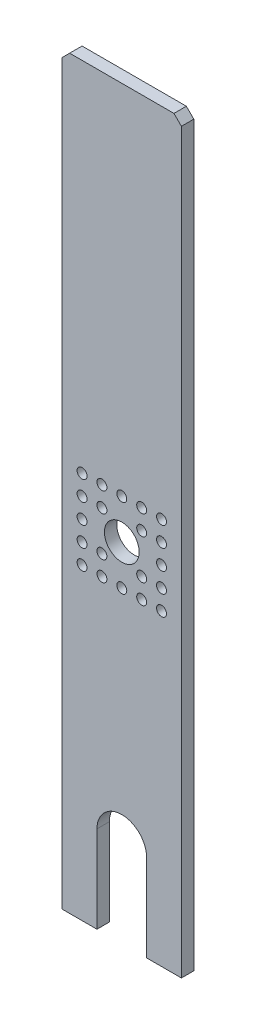
ISO-10303-21;
HEADER;
FILE_DESCRIPTION(('STEP AP214'),'2;1');
FILE_NAME('part.step','',(''),(''),'','','');
FILE_SCHEMA(('AUTOMOTIVE_DESIGN { 1 0 10303 214 1 1 1 1 }'));
ENDSEC;
DATA;
#1=APPLICATION_CONTEXT('core data for automotive mechanical design processes');
#2=APPLICATION_PROTOCOL_DEFINITION('international standard','automotive_design',2000,#1);
#3=PRODUCT_CONTEXT('',#1,'mechanical');
#4=PRODUCT('Part','Part','',(#3));
#5=PRODUCT_RELATED_PRODUCT_CATEGORY('part','',(#4));
#6=PRODUCT_DEFINITION_FORMATION('','',#4);
#7=PRODUCT_DEFINITION_CONTEXT('part definition',#1,'design');
#8=PRODUCT_DEFINITION('design','',#6,#7);
#9=PRODUCT_DEFINITION_SHAPE('','',#8);
#10=(LENGTH_UNIT() NAMED_UNIT(*) SI_UNIT(.MILLI.,.METRE.));
#11=(NAMED_UNIT(*) PLANE_ANGLE_UNIT() SI_UNIT($,.RADIAN.));
#12=(NAMED_UNIT(*) SI_UNIT($,.STERADIAN.) SOLID_ANGLE_UNIT());
#13=UNCERTAINTY_MEASURE_WITH_UNIT(LENGTH_MEASURE(1.E-05),#10,'distance_accuracy_value','');
#14=(GEOMETRIC_REPRESENTATION_CONTEXT(3) GLOBAL_UNCERTAINTY_ASSIGNED_CONTEXT((#13)) GLOBAL_UNIT_ASSIGNED_CONTEXT((#10,
#11,#12)) REPRESENTATION_CONTEXT('',''));
#15=CARTESIAN_POINT('',(0.,0.,0.));
#16=DIRECTION('',(0.,0.,1.));
#17=DIRECTION('',(1.,0.,0.));
#18=AXIS2_PLACEMENT_3D('',#15,#16,#17);
#19=CARTESIAN_POINT('',(0.,-300.,5.));
#20=DIRECTION('',(0.,1.,0.));
#21=DIRECTION('',(0.,0.,1.));
#22=AXIS2_PLACEMENT_3D('',#19,#20,#21);
#23=PLANE('',#22);
#24=DIRECTION('',(1.,0.,0.));
#25=VECTOR('',#24,1.);
#26=CARTESIAN_POINT('',(0.,-300.,5.));
#27=LINE('',#26,#25);
#28=CARTESIAN_POINT('',(34.,-300.,5.));
#29=VERTEX_POINT('',#28);
#30=CARTESIAN_POINT('',(48.,-300.,5.));
#31=VERTEX_POINT('',#30);
#32=EDGE_CURVE('E340',#29,#31,#27,.T.);
#33=ORIENTED_EDGE('',*,*,#32,.F.);
#34=DIRECTION('',(0.,0.,1.));
#35=VECTOR('',#34,1.);
#36=CARTESIAN_POINT('',(34.,-300.,0.));
#37=LINE('',#36,#35);
#38=CARTESIAN_POINT('',(34.,-300.,0.));
#39=VERTEX_POINT('',#38);
#40=EDGE_CURVE('E159',#39,#29,#37,.T.);
#41=ORIENTED_EDGE('',*,*,#40,.F.);
#42=DIRECTION('',(1.,0.,0.));
#43=VECTOR('',#42,1.);
#44=CARTESIAN_POINT('',(0.,-300.,0.));
#45=LINE('',#44,#43);
#46=CARTESIAN_POINT('',(48.,-300.,0.));
#47=VERTEX_POINT('',#46);
#48=EDGE_CURVE('E355',#39,#47,#45,.T.);
#49=ORIENTED_EDGE('',*,*,#48,.T.);
#50=DIRECTION('',(0.,0.,-1.));
#51=VECTOR('',#50,1.);
#52=CARTESIAN_POINT('',(48.,-300.,5.));
#53=LINE('',#52,#51);
#54=EDGE_CURVE('E348',#31,#47,#53,.T.);
#55=ORIENTED_EDGE('',*,*,#54,.F.);
#56=EDGE_LOOP('',(#33,#41,#49,#55));
#57=FACE_BOUND('',#56,.T.);
#58=ADVANCED_FACE('F40',(#57),#23,.F.);
#59=CARTESIAN_POINT('',(0.,0.,5.));
#60=DIRECTION('',(0.,0.,1.));
#61=DIRECTION('',(1.,0.,0.));
#62=AXIS2_PLACEMENT_3D('',#59,#60,#61);
#63=PLANE('',#62);
#64=DIRECTION('',(0.,1.,0.));
#65=VECTOR('',#64,1.);
#66=CARTESIAN_POINT('',(34.,-300.,5.));
#67=LINE('',#66,#65);
#68=CARTESIAN_POINT('',(34.,-265.,5.));
#69=VERTEX_POINT('',#68);
#70=EDGE_CURVE('E143',#29,#69,#67,.T.);
#71=ORIENTED_EDGE('',*,*,#70,.F.);
#72=ORIENTED_EDGE('',*,*,#32,.T.);
#73=DIRECTION('',(0.,1.,0.));
#74=VECTOR('',#73,1.);
#75=CARTESIAN_POINT('',(48.,-300.,5.));
#76=LINE('',#75,#74);
#77=CARTESIAN_POINT('',(48.,-3.00000000000006,5.));
#78=VERTEX_POINT('',#77);
#79=EDGE_CURVE('E345',#31,#78,#76,.T.);
#80=ORIENTED_EDGE('',*,*,#79,.T.);
#81=DIRECTION('',(0.707106781186544,-0.707106781186551,0.));
#82=VECTOR('',#81,1.);
#83=CARTESIAN_POINT('',(22.5000000000002,22.5,5.));
#84=LINE('',#83,#82);
#85=CARTESIAN_POINT('',(45.,0.,5.));
#86=VERTEX_POINT('',#85);
#87=EDGE_CURVE('E385',#78,#86,#84,.F.);
#88=ORIENTED_EDGE('',*,*,#87,.T.);
#89=DIRECTION('',(-1.,0.,0.));
#90=VECTOR('',#89,1.);
#91=CARTESIAN_POINT('',(48.,0.,5.));
#92=LINE('',#91,#90);
#93=CARTESIAN_POINT('',(3.,0.,5.));
#94=VERTEX_POINT('',#93);
#95=EDGE_CURVE('E332',#86,#94,#92,.T.);
#96=ORIENTED_EDGE('',*,*,#95,.T.);
#97=DIRECTION('',(0.707106781186547,0.707106781186548,0.));
#98=VECTOR('',#97,1.);
#99=CARTESIAN_POINT('',(1.5,-1.5,5.));
#100=LINE('',#99,#98);
#101=CARTESIAN_POINT('',(0.,-3.,5.));
#102=VERTEX_POINT('',#101);
#103=EDGE_CURVE('E50',#94,#102,#100,.F.);
#104=ORIENTED_EDGE('',*,*,#103,.T.);
#105=DIRECTION('',(0.,-1.,0.));
#106=VECTOR('',#105,1.);
#107=CARTESIAN_POINT('',(0.,0.,5.));
#108=LINE('',#107,#106);
#109=CARTESIAN_POINT('',(0.,-300.,5.));
#110=VERTEX_POINT('',#109);
#111=EDGE_CURVE('E336',#102,#110,#108,.T.);
#112=ORIENTED_EDGE('',*,*,#111,.T.);
#113=CARTESIAN_POINT('',(14.,-300.,5.));
#114=VERTEX_POINT('',#113);
#115=EDGE_CURVE('E341',#110,#114,#27,.T.);
#116=ORIENTED_EDGE('',*,*,#115,.T.);
#117=DIRECTION('',(0.,-1.,0.));
#118=VECTOR('',#117,1.);
#119=CARTESIAN_POINT('',(14.,-265.,5.));
#120=LINE('',#119,#118);
#121=CARTESIAN_POINT('',(14.,-265.,5.));
#122=VERTEX_POINT('',#121);
#123=EDGE_CURVE('E57',#122,#114,#120,.T.);
#124=ORIENTED_EDGE('',*,*,#123,.F.);
#125=CARTESIAN_POINT('',(24.,-265.,5.));
#126=DIRECTION('',(0.,0.,1.));
#127=DIRECTION('',(1.,0.,0.));
#128=AXIS2_PLACEMENT_3D('',#125,#126,#127);
#129=CIRCLE('',#128,10.);
#130=EDGE_CURVE('E126',#69,#122,#129,.T.);
#131=ORIENTED_EDGE('',*,*,#130,.F.);
#132=EDGE_LOOP('',(#71,#72,#80,#88,#96,#104,#112,#116,#124,#131));
#133=FACE_BOUND('',#132,.T.);
#134=CARTESIAN_POINT('',(8.00000000000027,-168.,5.));
#135=DIRECTION('',(0.,0.,1.));
#136=DIRECTION('',(1.,0.,0.));
#137=AXIS2_PLACEMENT_3D('',#134,#135,#136);
#138=CIRCLE('',#137,2.);
#139=CARTESIAN_POINT('',(10.0000000000003,-168.,5.));
#140=VERTEX_POINT('',#139);
#141=EDGE_CURVE('E172',#140,#140,#138,.T.);
#142=ORIENTED_EDGE('',*,*,#141,.F.);
#143=EDGE_LOOP('',(#142));
#144=FACE_BOUND('',#143,.T.);
#145=CARTESIAN_POINT('',(8.0000000000001,-152.,5.));
#146=DIRECTION('',(0.,0.,1.));
#147=DIRECTION('',(1.,0.,0.));
#148=AXIS2_PLACEMENT_3D('',#145,#146,#147);
#149=CIRCLE('',#148,2.);
#150=CARTESIAN_POINT('',(10.0000000000001,-152.,5.));
#151=VERTEX_POINT('',#150);
#152=EDGE_CURVE('E188',#151,#151,#149,.T.);
#153=ORIENTED_EDGE('',*,*,#152,.F.);
#154=EDGE_LOOP('',(#153));
#155=FACE_BOUND('',#154,.T.);
#156=CARTESIAN_POINT('',(32.0000000000003,-176.,5.));
#157=DIRECTION('',(0.,0.,1.));
#158=DIRECTION('',(1.,0.,0.));
#159=AXIS2_PLACEMENT_3D('',#156,#157,#158);
#160=CIRCLE('',#159,2.);
#161=CARTESIAN_POINT('',(34.0000000000003,-176.,5.));
#162=VERTEX_POINT('',#161);
#163=EDGE_CURVE('E204',#162,#162,#160,.T.);
#164=ORIENTED_EDGE('',*,*,#163,.F.);
#165=EDGE_LOOP('',(#164));
#166=FACE_BOUND('',#165,.T.);
#167=CARTESIAN_POINT('',(16.0000000000003,-176.,5.));
#168=DIRECTION('',(0.,0.,1.));
#169=DIRECTION('',(1.,0.,0.));
#170=AXIS2_PLACEMENT_3D('',#167,#168,#169);
#171=CIRCLE('',#170,2.);
#172=CARTESIAN_POINT('',(18.0000000000003,-176.,5.));
#173=VERTEX_POINT('',#172);
#174=EDGE_CURVE('E220',#173,#173,#171,.T.);
#175=ORIENTED_EDGE('',*,*,#174,.F.);
#176=EDGE_LOOP('',(#175));
#177=FACE_BOUND('',#176,.T.);
#178=CARTESIAN_POINT('',(32.0000000000003,-168.,5.));
#179=DIRECTION('',(0.,0.,1.));
#180=DIRECTION('',(1.,0.,0.));
#181=AXIS2_PLACEMENT_3D('',#178,#179,#180);
#182=CIRCLE('',#181,2.);
#183=CARTESIAN_POINT('',(34.0000000000003,-168.,5.));
#184=VERTEX_POINT('',#183);
#185=EDGE_CURVE('E236',#184,#184,#182,.T.);
#186=ORIENTED_EDGE('',*,*,#185,.F.);
#187=EDGE_LOOP('',(#186));
#188=FACE_BOUND('',#187,.T.);
#189=CARTESIAN_POINT('',(40.0000000000002,-160.,5.));
#190=DIRECTION('',(0.,0.,1.));
#191=DIRECTION('',(1.,0.,0.));
#192=AXIS2_PLACEMENT_3D('',#189,#190,#191);
#193=CIRCLE('',#192,2.);
#194=CARTESIAN_POINT('',(42.0000000000002,-160.,5.));
#195=VERTEX_POINT('',#194);
#196=EDGE_CURVE('E252',#195,#195,#193,.T.);
#197=ORIENTED_EDGE('',*,*,#196,.F.);
#198=EDGE_LOOP('',(#197));
#199=FACE_BOUND('',#198,.T.);
#200=CARTESIAN_POINT('',(32.0000000000001,-152.,5.));
#201=DIRECTION('',(0.,0.,1.));
#202=DIRECTION('',(1.,0.,0.));
#203=AXIS2_PLACEMENT_3D('',#200,#201,#202);
#204=CIRCLE('',#203,2.);
#205=CARTESIAN_POINT('',(34.0000000000001,-152.,5.));
#206=VERTEX_POINT('',#205);
#207=EDGE_CURVE('E268',#206,#206,#204,.T.);
#208=ORIENTED_EDGE('',*,*,#207,.F.);
#209=EDGE_LOOP('',(#208));
#210=FACE_BOUND('',#209,.T.);
#211=CARTESIAN_POINT('',(40.,-144.,5.));
#212=DIRECTION('',(0.,0.,1.));
#213=DIRECTION('',(1.,0.,0.));
#214=AXIS2_PLACEMENT_3D('',#211,#212,#213);
#215=CIRCLE('',#214,2.);
#216=CARTESIAN_POINT('',(42.,-144.,5.));
#217=VERTEX_POINT('',#216);
#218=EDGE_CURVE('E284',#217,#217,#215,.T.);
#219=ORIENTED_EDGE('',*,*,#218,.F.);
#220=EDGE_LOOP('',(#219));
#221=FACE_BOUND('',#220,.T.);
#222=CARTESIAN_POINT('',(24.,-144.,5.));
#223=DIRECTION('',(0.,0.,1.));
#224=DIRECTION('',(1.,0.,0.));
#225=AXIS2_PLACEMENT_3D('',#222,#223,#224);
#226=CIRCLE('',#225,2.00000000000001);
#227=CARTESIAN_POINT('',(26.,-144.,5.));
#228=VERTEX_POINT('',#227);
#229=EDGE_CURVE('E300',#228,#228,#226,.T.);
#230=ORIENTED_EDGE('',*,*,#229,.F.);
#231=EDGE_LOOP('',(#230));
#232=FACE_BOUND('',#231,.T.);
#233=CARTESIAN_POINT('',(8.00000000000002,-144.,5.));
#234=DIRECTION('',(0.,0.,1.));
#235=DIRECTION('',(1.,0.,0.));
#236=AXIS2_PLACEMENT_3D('',#233,#234,#235);
#237=CIRCLE('',#236,1.99999999999999);
#238=CARTESIAN_POINT('',(10.,-144.,5.));
#239=VERTEX_POINT('',#238);
#240=EDGE_CURVE('E316',#239,#239,#237,.T.);
#241=ORIENTED_EDGE('',*,*,#240,.F.);
#242=EDGE_LOOP('',(#241));
#243=FACE_BOUND('',#242,.T.);
#244=CARTESIAN_POINT('',(24.,-160.,5.));
#245=DIRECTION('',(0.,0.,1.));
#246=DIRECTION('',(1.,0.,0.));
#247=AXIS2_PLACEMENT_3D('',#244,#245,#246);
#248=CIRCLE('',#247,6.99999999999999);
#249=CARTESIAN_POINT('',(31.,-160.,5.));
#250=VERTEX_POINT('',#249);
#251=EDGE_CURVE('E324',#250,#250,#248,.T.);
#252=ORIENTED_EDGE('',*,*,#251,.F.);
#253=EDGE_LOOP('',(#252));
#254=FACE_BOUND('',#253,.T.);
#255=CARTESIAN_POINT('',(16.,-144.,5.));
#256=DIRECTION('',(0.,0.,1.));
#257=DIRECTION('',(1.,0.,0.));
#258=AXIS2_PLACEMENT_3D('',#255,#256,#257);
#259=CIRCLE('',#258,2.);
#260=CARTESIAN_POINT('',(18.,-144.,5.));
#261=VERTEX_POINT('',#260);
#262=EDGE_CURVE('E308',#261,#261,#259,.T.);
#263=ORIENTED_EDGE('',*,*,#262,.F.);
#264=EDGE_LOOP('',(#263));
#265=FACE_BOUND('',#264,.T.);
#266=CARTESIAN_POINT('',(32.,-144.,5.));
#267=DIRECTION('',(0.,0.,1.));
#268=DIRECTION('',(1.,0.,0.));
#269=AXIS2_PLACEMENT_3D('',#266,#267,#268);
#270=CIRCLE('',#269,2.);
#271=CARTESIAN_POINT('',(34.,-144.,5.));
#272=VERTEX_POINT('',#271);
#273=EDGE_CURVE('E292',#272,#272,#270,.T.);
#274=ORIENTED_EDGE('',*,*,#273,.F.);
#275=EDGE_LOOP('',(#274));
#276=FACE_BOUND('',#275,.T.);
#277=CARTESIAN_POINT('',(16.0000000000001,-152.,5.));
#278=DIRECTION('',(0.,0.,1.));
#279=DIRECTION('',(1.,0.,0.));
#280=AXIS2_PLACEMENT_3D('',#277,#278,#279);
#281=CIRCLE('',#280,2.);
#282=CARTESIAN_POINT('',(18.0000000000001,-152.,5.));
#283=VERTEX_POINT('',#282);
#284=EDGE_CURVE('E276',#283,#283,#281,.T.);
#285=ORIENTED_EDGE('',*,*,#284,.F.);
#286=EDGE_LOOP('',(#285));
#287=FACE_BOUND('',#286,.T.);
#288=CARTESIAN_POINT('',(40.0000000000001,-152.,5.));
#289=DIRECTION('',(0.,0.,1.));
#290=DIRECTION('',(1.,0.,0.));
#291=AXIS2_PLACEMENT_3D('',#288,#289,#290);
#292=CIRCLE('',#291,2.);
#293=CARTESIAN_POINT('',(42.0000000000001,-152.,5.));
#294=VERTEX_POINT('',#293);
#295=EDGE_CURVE('E260',#294,#294,#292,.T.);
#296=ORIENTED_EDGE('',*,*,#295,.F.);
#297=EDGE_LOOP('',(#296));
#298=FACE_BOUND('',#297,.T.);
#299=CARTESIAN_POINT('',(16.0000000000003,-168.,5.));
#300=DIRECTION('',(0.,0.,1.));
#301=DIRECTION('',(1.,0.,0.));
#302=AXIS2_PLACEMENT_3D('',#299,#300,#301);
#303=CIRCLE('',#302,2.);
#304=CARTESIAN_POINT('',(18.0000000000003,-168.,5.));
#305=VERTEX_POINT('',#304);
#306=EDGE_CURVE('E244',#305,#305,#303,.T.);
#307=ORIENTED_EDGE('',*,*,#306,.F.);
#308=EDGE_LOOP('',(#307));
#309=FACE_BOUND('',#308,.T.);
#310=CARTESIAN_POINT('',(40.0000000000003,-168.,5.));
#311=DIRECTION('',(0.,0.,1.));
#312=DIRECTION('',(1.,0.,0.));
#313=AXIS2_PLACEMENT_3D('',#310,#311,#312);
#314=CIRCLE('',#313,2.);
#315=CARTESIAN_POINT('',(42.0000000000003,-168.,5.));
#316=VERTEX_POINT('',#315);
#317=EDGE_CURVE('E228',#316,#316,#314,.T.);
#318=ORIENTED_EDGE('',*,*,#317,.F.);
#319=EDGE_LOOP('',(#318));
#320=FACE_BOUND('',#319,.T.);
#321=CARTESIAN_POINT('',(24.0000000000003,-176.,5.));
#322=DIRECTION('',(0.,0.,1.));
#323=DIRECTION('',(1.,0.,0.));
#324=AXIS2_PLACEMENT_3D('',#321,#322,#323);
#325=CIRCLE('',#324,2.00000000000001);
#326=CARTESIAN_POINT('',(26.0000000000004,-176.,5.));
#327=VERTEX_POINT('',#326);
#328=EDGE_CURVE('E212',#327,#327,#325,.T.);
#329=ORIENTED_EDGE('',*,*,#328,.F.);
#330=EDGE_LOOP('',(#329));
#331=FACE_BOUND('',#330,.T.);
#332=CARTESIAN_POINT('',(40.0000000000003,-176.,5.));
#333=DIRECTION('',(0.,0.,1.));
#334=DIRECTION('',(1.,0.,0.));
#335=AXIS2_PLACEMENT_3D('',#332,#333,#334);
#336=CIRCLE('',#335,2.);
#337=CARTESIAN_POINT('',(42.0000000000003,-176.,5.));
#338=VERTEX_POINT('',#337);
#339=EDGE_CURVE('E196',#338,#338,#336,.T.);
#340=ORIENTED_EDGE('',*,*,#339,.F.);
#341=EDGE_LOOP('',(#340));
#342=FACE_BOUND('',#341,.T.);
#343=CARTESIAN_POINT('',(8.00000000000018,-160.,5.));
#344=DIRECTION('',(0.,0.,1.));
#345=DIRECTION('',(1.,0.,0.));
#346=AXIS2_PLACEMENT_3D('',#343,#344,#345);
#347=CIRCLE('',#346,2.);
#348=CARTESIAN_POINT('',(10.0000000000002,-160.,5.));
#349=VERTEX_POINT('',#348);
#350=EDGE_CURVE('E180',#349,#349,#347,.T.);
#351=ORIENTED_EDGE('',*,*,#350,.F.);
#352=EDGE_LOOP('',(#351));
#353=FACE_BOUND('',#352,.T.);
#354=CARTESIAN_POINT('',(8.00000000000035,-176.,5.));
#355=DIRECTION('',(0.,0.,1.));
#356=DIRECTION('',(1.,0.,0.));
#357=AXIS2_PLACEMENT_3D('',#354,#355,#356);
#358=CIRCLE('',#357,2.);
#359=CARTESIAN_POINT('',(10.0000000000003,-176.,5.));
#360=VERTEX_POINT('',#359);
#361=EDGE_CURVE('E164',#360,#360,#358,.T.);
#362=ORIENTED_EDGE('',*,*,#361,.F.);
#363=EDGE_LOOP('',(#362));
#364=FACE_BOUND('',#363,.T.);
#365=ADVANCED_FACE('F392',(#133,#144,#155,#166,#177,#188,#199,#210,#221,#232,#243,#254,#265,
#276,#287,#298,#309,#320,#331,#342,#353,#364),#63,.T.);
#366=CARTESIAN_POINT('',(0.,0.,0.));
#367=DIRECTION('',(0.,0.,1.));
#368=DIRECTION('',(1.,0.,0.));
#369=AXIS2_PLACEMENT_3D('',#366,#367,#368);
#370=PLANE('',#369);
#371=ORIENTED_EDGE('',*,*,#48,.F.);
#372=DIRECTION('',(0.,1.,0.));
#373=VECTOR('',#372,1.);
#374=CARTESIAN_POINT('',(34.,-300.,0.));
#375=LINE('',#374,#373);
#376=CARTESIAN_POINT('',(34.,-265.,0.));
#377=VERTEX_POINT('',#376);
#378=EDGE_CURVE('E129',#39,#377,#375,.T.);
#379=ORIENTED_EDGE('',*,*,#378,.T.);
#380=CARTESIAN_POINT('',(24.,-265.,0.));
#381=DIRECTION('',(0.,0.,1.));
#382=DIRECTION('',(1.,0.,0.));
#383=AXIS2_PLACEMENT_3D('',#380,#381,#382);
#384=CIRCLE('',#383,10.);
#385=CARTESIAN_POINT('',(14.,-265.,0.));
#386=VERTEX_POINT('',#385);
#387=EDGE_CURVE('E123',#377,#386,#384,.T.);
#388=ORIENTED_EDGE('',*,*,#387,.T.);
#389=DIRECTION('',(0.,-1.,0.));
#390=VECTOR('',#389,1.);
#391=CARTESIAN_POINT('',(14.,-265.,0.));
#392=LINE('',#391,#390);
#393=CARTESIAN_POINT('',(14.,-300.,0.));
#394=VERTEX_POINT('',#393);
#395=EDGE_CURVE('E132',#386,#394,#392,.T.);
#396=ORIENTED_EDGE('',*,*,#395,.T.);
#397=CARTESIAN_POINT('',(0.,-300.,0.));
#398=VERTEX_POINT('',#397);
#399=EDGE_CURVE('E356',#398,#394,#45,.T.);
#400=ORIENTED_EDGE('',*,*,#399,.F.);
#401=DIRECTION('',(0.,-1.,0.));
#402=VECTOR('',#401,1.);
#403=CARTESIAN_POINT('',(0.,0.,0.));
#404=LINE('',#403,#402);
#405=CARTESIAN_POINT('',(0.,-3.,0.));
#406=VERTEX_POINT('',#405);
#407=EDGE_CURVE('E352',#406,#398,#404,.T.);
#408=ORIENTED_EDGE('',*,*,#407,.F.);
#409=DIRECTION('',(-0.707106781186547,-0.707106781186548,0.));
#410=VECTOR('',#409,1.);
#411=CARTESIAN_POINT('',(0.,-3.,0.));
#412=LINE('',#411,#410);
#413=CARTESIAN_POINT('',(3.,0.,0.));
#414=VERTEX_POINT('',#413);
#415=EDGE_CURVE('E375',#406,#414,#412,.F.);
#416=ORIENTED_EDGE('',*,*,#415,.T.);
#417=DIRECTION('',(-1.,0.,0.));
#418=VECTOR('',#417,1.);
#419=CARTESIAN_POINT('',(48.,0.,0.));
#420=LINE('',#419,#418);
#421=CARTESIAN_POINT('',(45.,0.,0.));
#422=VERTEX_POINT('',#421);
#423=EDGE_CURVE('E328',#422,#414,#420,.T.);
#424=ORIENTED_EDGE('',*,*,#423,.F.);
#425=DIRECTION('',(-0.707106781186544,0.707106781186551,0.));
#426=VECTOR('',#425,1.);
#427=CARTESIAN_POINT('',(45.,0.,0.));
#428=LINE('',#427,#426);
#429=CARTESIAN_POINT('',(48.,-3.00000000000006,0.));
#430=VERTEX_POINT('',#429);
#431=EDGE_CURVE('E372',#422,#430,#428,.F.);
#432=ORIENTED_EDGE('',*,*,#431,.T.);
#433=DIRECTION('',(0.,1.,0.));
#434=VECTOR('',#433,1.);
#435=CARTESIAN_POINT('',(48.,-300.,0.));
#436=LINE('',#435,#434);
#437=EDGE_CURVE('E337',#47,#430,#436,.T.);
#438=ORIENTED_EDGE('',*,*,#437,.F.);
#439=EDGE_LOOP('',(#371,#379,#388,#396,#400,#408,#416,#424,#432,#438));
#440=FACE_BOUND('',#439,.T.);
#441=CARTESIAN_POINT('',(24.,-160.,0.));
#442=DIRECTION('',(0.,0.,1.));
#443=DIRECTION('',(1.,0.,0.));
#444=AXIS2_PLACEMENT_3D('',#441,#442,#443);
#445=CIRCLE('',#444,6.99999999999999);
#446=CARTESIAN_POINT('',(31.,-160.,0.));
#447=VERTEX_POINT('',#446);
#448=EDGE_CURVE('E320',#447,#447,#445,.T.);
#449=ORIENTED_EDGE('',*,*,#448,.T.);
#450=EDGE_LOOP('',(#449));
#451=FACE_BOUND('',#450,.T.);
#452=CARTESIAN_POINT('',(8.00000000000002,-144.,0.));
#453=DIRECTION('',(0.,0.,1.));
#454=DIRECTION('',(1.,0.,0.));
#455=AXIS2_PLACEMENT_3D('',#452,#453,#454);
#456=CIRCLE('',#455,1.99999999999999);
#457=CARTESIAN_POINT('',(10.,-144.,0.));
#458=VERTEX_POINT('',#457);
#459=EDGE_CURVE('E312',#458,#458,#456,.T.);
#460=ORIENTED_EDGE('',*,*,#459,.T.);
#461=EDGE_LOOP('',(#460));
#462=FACE_BOUND('',#461,.T.);
#463=CARTESIAN_POINT('',(16.,-144.,0.));
#464=DIRECTION('',(0.,0.,1.));
#465=DIRECTION('',(1.,0.,0.));
#466=AXIS2_PLACEMENT_3D('',#463,#464,#465);
#467=CIRCLE('',#466,2.);
#468=CARTESIAN_POINT('',(18.,-144.,0.));
#469=VERTEX_POINT('',#468);
#470=EDGE_CURVE('E304',#469,#469,#467,.T.);
#471=ORIENTED_EDGE('',*,*,#470,.T.);
#472=EDGE_LOOP('',(#471));
#473=FACE_BOUND('',#472,.T.);
#474=CARTESIAN_POINT('',(24.,-144.,0.));
#475=DIRECTION('',(0.,0.,1.));
#476=DIRECTION('',(1.,0.,0.));
#477=AXIS2_PLACEMENT_3D('',#474,#475,#476);
#478=CIRCLE('',#477,2.00000000000001);
#479=CARTESIAN_POINT('',(26.,-144.,0.));
#480=VERTEX_POINT('',#479);
#481=EDGE_CURVE('E296',#480,#480,#478,.T.);
#482=ORIENTED_EDGE('',*,*,#481,.T.);
#483=EDGE_LOOP('',(#482));
#484=FACE_BOUND('',#483,.T.);
#485=CARTESIAN_POINT('',(32.,-144.,0.));
#486=DIRECTION('',(0.,0.,1.));
#487=DIRECTION('',(1.,0.,0.));
#488=AXIS2_PLACEMENT_3D('',#485,#486,#487);
#489=CIRCLE('',#488,2.);
#490=CARTESIAN_POINT('',(34.,-144.,0.));
#491=VERTEX_POINT('',#490);
#492=EDGE_CURVE('E288',#491,#491,#489,.T.);
#493=ORIENTED_EDGE('',*,*,#492,.T.);
#494=EDGE_LOOP('',(#493));
#495=FACE_BOUND('',#494,.T.);
#496=CARTESIAN_POINT('',(40.,-144.,0.));
#497=DIRECTION('',(0.,0.,1.));
#498=DIRECTION('',(1.,0.,0.));
#499=AXIS2_PLACEMENT_3D('',#496,#497,#498);
#500=CIRCLE('',#499,2.);
#501=CARTESIAN_POINT('',(42.,-144.,0.));
#502=VERTEX_POINT('',#501);
#503=EDGE_CURVE('E280',#502,#502,#500,.T.);
#504=ORIENTED_EDGE('',*,*,#503,.T.);
#505=EDGE_LOOP('',(#504));
#506=FACE_BOUND('',#505,.T.);
#507=CARTESIAN_POINT('',(16.0000000000001,-152.,0.));
#508=DIRECTION('',(0.,0.,1.));
#509=DIRECTION('',(1.,0.,0.));
#510=AXIS2_PLACEMENT_3D('',#507,#508,#509);
#511=CIRCLE('',#510,2.);
#512=CARTESIAN_POINT('',(18.0000000000001,-152.,0.));
#513=VERTEX_POINT('',#512);
#514=EDGE_CURVE('E272',#513,#513,#511,.T.);
#515=ORIENTED_EDGE('',*,*,#514,.T.);
#516=EDGE_LOOP('',(#515));
#517=FACE_BOUND('',#516,.T.);
#518=CARTESIAN_POINT('',(32.0000000000001,-152.,0.));
#519=DIRECTION('',(0.,0.,1.));
#520=DIRECTION('',(1.,0.,0.));
#521=AXIS2_PLACEMENT_3D('',#518,#519,#520);
#522=CIRCLE('',#521,2.);
#523=CARTESIAN_POINT('',(34.0000000000001,-152.,0.));
#524=VERTEX_POINT('',#523);
#525=EDGE_CURVE('E264',#524,#524,#522,.T.);
#526=ORIENTED_EDGE('',*,*,#525,.T.);
#527=EDGE_LOOP('',(#526));
#528=FACE_BOUND('',#527,.T.);
#529=CARTESIAN_POINT('',(40.0000000000001,-152.,0.));
#530=DIRECTION('',(0.,0.,1.));
#531=DIRECTION('',(1.,0.,0.));
#532=AXIS2_PLACEMENT_3D('',#529,#530,#531);
#533=CIRCLE('',#532,2.);
#534=CARTESIAN_POINT('',(42.0000000000001,-152.,0.));
#535=VERTEX_POINT('',#534);
#536=EDGE_CURVE('E256',#535,#535,#533,.T.);
#537=ORIENTED_EDGE('',*,*,#536,.T.);
#538=EDGE_LOOP('',(#537));
#539=FACE_BOUND('',#538,.T.);
#540=CARTESIAN_POINT('',(40.0000000000002,-160.,0.));
#541=DIRECTION('',(0.,0.,1.));
#542=DIRECTION('',(1.,0.,0.));
#543=AXIS2_PLACEMENT_3D('',#540,#541,#542);
#544=CIRCLE('',#543,2.);
#545=CARTESIAN_POINT('',(42.0000000000002,-160.,0.));
#546=VERTEX_POINT('',#545);
#547=EDGE_CURVE('E248',#546,#546,#544,.T.);
#548=ORIENTED_EDGE('',*,*,#547,.T.);
#549=EDGE_LOOP('',(#548));
#550=FACE_BOUND('',#549,.T.);
#551=CARTESIAN_POINT('',(16.0000000000003,-168.,0.));
#552=DIRECTION('',(0.,0.,1.));
#553=DIRECTION('',(1.,0.,0.));
#554=AXIS2_PLACEMENT_3D('',#551,#552,#553);
#555=CIRCLE('',#554,2.);
#556=CARTESIAN_POINT('',(18.0000000000003,-168.,0.));
#557=VERTEX_POINT('',#556);
#558=EDGE_CURVE('E240',#557,#557,#555,.T.);
#559=ORIENTED_EDGE('',*,*,#558,.T.);
#560=EDGE_LOOP('',(#559));
#561=FACE_BOUND('',#560,.T.);
#562=CARTESIAN_POINT('',(32.0000000000003,-168.,0.));
#563=DIRECTION('',(0.,0.,1.));
#564=DIRECTION('',(1.,0.,0.));
#565=AXIS2_PLACEMENT_3D('',#562,#563,#564);
#566=CIRCLE('',#565,2.);
#567=CARTESIAN_POINT('',(34.0000000000003,-168.,0.));
#568=VERTEX_POINT('',#567);
#569=EDGE_CURVE('E232',#568,#568,#566,.T.);
#570=ORIENTED_EDGE('',*,*,#569,.T.);
#571=EDGE_LOOP('',(#570));
#572=FACE_BOUND('',#571,.T.);
#573=CARTESIAN_POINT('',(40.0000000000003,-168.,0.));
#574=DIRECTION('',(0.,0.,1.));
#575=DIRECTION('',(1.,0.,0.));
#576=AXIS2_PLACEMENT_3D('',#573,#574,#575);
#577=CIRCLE('',#576,2.);
#578=CARTESIAN_POINT('',(42.0000000000003,-168.,0.));
#579=VERTEX_POINT('',#578);
#580=EDGE_CURVE('E224',#579,#579,#577,.T.);
#581=ORIENTED_EDGE('',*,*,#580,.T.);
#582=EDGE_LOOP('',(#581));
#583=FACE_BOUND('',#582,.T.);
#584=CARTESIAN_POINT('',(16.0000000000003,-176.,0.));
#585=DIRECTION('',(0.,0.,1.));
#586=DIRECTION('',(1.,0.,0.));
#587=AXIS2_PLACEMENT_3D('',#584,#585,#586);
#588=CIRCLE('',#587,2.);
#589=CARTESIAN_POINT('',(18.0000000000003,-176.,0.));
#590=VERTEX_POINT('',#589);
#591=EDGE_CURVE('E216',#590,#590,#588,.T.);
#592=ORIENTED_EDGE('',*,*,#591,.T.);
#593=EDGE_LOOP('',(#592));
#594=FACE_BOUND('',#593,.T.);
#595=CARTESIAN_POINT('',(24.0000000000003,-176.,0.));
#596=DIRECTION('',(0.,0.,1.));
#597=DIRECTION('',(1.,0.,0.));
#598=AXIS2_PLACEMENT_3D('',#595,#596,#597);
#599=CIRCLE('',#598,2.00000000000001);
#600=CARTESIAN_POINT('',(26.0000000000004,-176.,0.));
#601=VERTEX_POINT('',#600);
#602=EDGE_CURVE('E208',#601,#601,#599,.T.);
#603=ORIENTED_EDGE('',*,*,#602,.T.);
#604=EDGE_LOOP('',(#603));
#605=FACE_BOUND('',#604,.T.);
#606=CARTESIAN_POINT('',(32.0000000000003,-176.,0.));
#607=DIRECTION('',(0.,0.,1.));
#608=DIRECTION('',(1.,0.,0.));
#609=AXIS2_PLACEMENT_3D('',#606,#607,#608);
#610=CIRCLE('',#609,2.);
#611=CARTESIAN_POINT('',(34.0000000000003,-176.,0.));
#612=VERTEX_POINT('',#611);
#613=EDGE_CURVE('E200',#612,#612,#610,.T.);
#614=ORIENTED_EDGE('',*,*,#613,.T.);
#615=EDGE_LOOP('',(#614));
#616=FACE_BOUND('',#615,.T.);
#617=CARTESIAN_POINT('',(40.0000000000003,-176.,0.));
#618=DIRECTION('',(0.,0.,1.));
#619=DIRECTION('',(1.,0.,0.));
#620=AXIS2_PLACEMENT_3D('',#617,#618,#619);
#621=CIRCLE('',#620,2.);
#622=CARTESIAN_POINT('',(42.0000000000003,-176.,0.));
#623=VERTEX_POINT('',#622);
#624=EDGE_CURVE('E192',#623,#623,#621,.T.);
#625=ORIENTED_EDGE('',*,*,#624,.T.);
#626=EDGE_LOOP('',(#625));
#627=FACE_BOUND('',#626,.T.);
#628=CARTESIAN_POINT('',(8.0000000000001,-152.,0.));
#629=DIRECTION('',(0.,0.,1.));
#630=DIRECTION('',(1.,0.,0.));
#631=AXIS2_PLACEMENT_3D('',#628,#629,#630);
#632=CIRCLE('',#631,2.);
#633=CARTESIAN_POINT('',(10.0000000000001,-152.,0.));
#634=VERTEX_POINT('',#633);
#635=EDGE_CURVE('E184',#634,#634,#632,.T.);
#636=ORIENTED_EDGE('',*,*,#635,.T.);
#637=EDGE_LOOP('',(#636));
#638=FACE_BOUND('',#637,.T.);
#639=CARTESIAN_POINT('',(8.00000000000018,-160.,0.));
#640=DIRECTION('',(0.,0.,1.));
#641=DIRECTION('',(1.,0.,0.));
#642=AXIS2_PLACEMENT_3D('',#639,#640,#641);
#643=CIRCLE('',#642,2.);
#644=CARTESIAN_POINT('',(10.0000000000002,-160.,0.));
#645=VERTEX_POINT('',#644);
#646=EDGE_CURVE('E176',#645,#645,#643,.T.);
#647=ORIENTED_EDGE('',*,*,#646,.T.);
#648=EDGE_LOOP('',(#647));
#649=FACE_BOUND('',#648,.T.);
#650=CARTESIAN_POINT('',(8.00000000000027,-168.,0.));
#651=DIRECTION('',(0.,0.,1.));
#652=DIRECTION('',(1.,0.,0.));
#653=AXIS2_PLACEMENT_3D('',#650,#651,#652);
#654=CIRCLE('',#653,2.);
#655=CARTESIAN_POINT('',(10.0000000000003,-168.,0.));
#656=VERTEX_POINT('',#655);
#657=EDGE_CURVE('E168',#656,#656,#654,.T.);
#658=ORIENTED_EDGE('',*,*,#657,.T.);
#659=EDGE_LOOP('',(#658));
#660=FACE_BOUND('',#659,.T.);
#661=CARTESIAN_POINT('',(8.00000000000035,-176.,0.));
#662=DIRECTION('',(0.,0.,1.));
#663=DIRECTION('',(1.,0.,0.));
#664=AXIS2_PLACEMENT_3D('',#661,#662,#663);
#665=CIRCLE('',#664,2.);
#666=CARTESIAN_POINT('',(10.0000000000003,-176.,0.));
#667=VERTEX_POINT('',#666);
#668=EDGE_CURVE('E158',#667,#667,#665,.T.);
#669=ORIENTED_EDGE('',*,*,#668,.T.);
#670=EDGE_LOOP('',(#669));
#671=FACE_BOUND('',#670,.T.);
#672=ADVANCED_FACE('F140',(#440,#451,#462,#473,#484,#495,#506,#517,#528,#539,#550,#561,#572,
#583,#594,#605,#616,#627,#638,#649,#660,#671),#370,.F.);
#673=CARTESIAN_POINT('',(48.,0.,5.));
#674=DIRECTION('',(0.,-1.,0.));
#675=DIRECTION('',(0.,0.,-1.));
#676=AXIS2_PLACEMENT_3D('',#673,#674,#675);
#677=PLANE('',#676);
#678=ORIENTED_EDGE('',*,*,#423,.T.);
#679=DIRECTION('',(0.,0.,1.));
#680=VECTOR('',#679,1.);
#681=CARTESIAN_POINT('',(3.,0.,5.));
#682=LINE('',#681,#680);
#683=EDGE_CURVE('E382',#414,#94,#682,.T.);
#684=ORIENTED_EDGE('',*,*,#683,.T.);
#685=ORIENTED_EDGE('',*,*,#95,.F.);
#686=DIRECTION('',(0.,0.,-1.));
#687=VECTOR('',#686,1.);
#688=CARTESIAN_POINT('',(45.,0.,5.));
#689=LINE('',#688,#687);
#690=EDGE_CURVE('E378',#86,#422,#689,.T.);
#691=ORIENTED_EDGE('',*,*,#690,.T.);
#692=EDGE_LOOP('',(#678,#684,#685,#691));
#693=FACE_BOUND('',#692,.T.);
#694=ADVANCED_FACE('F406',(#693),#677,.F.);
#695=CARTESIAN_POINT('',(0.,0.,5.));
#696=DIRECTION('',(1.,0.,0.));
#697=DIRECTION('',(0.,1.,0.));
#698=AXIS2_PLACEMENT_3D('',#695,#696,#697);
#699=PLANE('',#698);
#700=ORIENTED_EDGE('',*,*,#111,.F.);
#701=DIRECTION('',(0.,0.,-1.));
#702=VECTOR('',#701,1.);
#703=CARTESIAN_POINT('',(0.,-3.,5.));
#704=LINE('',#703,#702);
#705=EDGE_CURVE('E368',#102,#406,#704,.T.);
#706=ORIENTED_EDGE('',*,*,#705,.T.);
#707=ORIENTED_EDGE('',*,*,#407,.T.);
#708=DIRECTION('',(0.,0.,-1.));
#709=VECTOR('',#708,1.);
#710=CARTESIAN_POINT('',(0.,-300.,5.));
#711=LINE('',#710,#709);
#712=EDGE_CURVE('E364',#110,#398,#711,.T.);
#713=ORIENTED_EDGE('',*,*,#712,.F.);
#714=EDGE_LOOP('',(#700,#706,#707,#713));
#715=FACE_BOUND('',#714,.T.);
#716=ADVANCED_FACE('F400',(#715),#699,.F.);
#717=ORIENTED_EDGE('',*,*,#399,.T.);
#718=DIRECTION('',(0.,0.,1.));
#719=VECTOR('',#718,1.);
#720=CARTESIAN_POINT('',(14.,-300.,0.));
#721=LINE('',#720,#719);
#722=EDGE_CURVE('E128',#394,#114,#721,.T.);
#723=ORIENTED_EDGE('',*,*,#722,.T.);
#724=ORIENTED_EDGE('',*,*,#115,.F.);
#725=ORIENTED_EDGE('',*,*,#712,.T.);
#726=EDGE_LOOP('',(#717,#723,#724,#725));
#727=FACE_BOUND('',#726,.T.);
#728=ADVANCED_FACE('F430',(#727),#23,.F.);
#729=CARTESIAN_POINT('',(48.,-300.,5.));
#730=DIRECTION('',(-1.,0.,0.));
#731=DIRECTION('',(0.,0.,1.));
#732=AXIS2_PLACEMENT_3D('',#729,#730,#731);
#733=PLANE('',#732);
#734=ORIENTED_EDGE('',*,*,#437,.T.);
#735=DIRECTION('',(0.,0.,1.));
#736=VECTOR('',#735,1.);
#737=CARTESIAN_POINT('',(48.,-3.00000000000006,5.));
#738=LINE('',#737,#736);
#739=EDGE_CURVE('E11',#430,#78,#738,.T.);
#740=ORIENTED_EDGE('',*,*,#739,.T.);
#741=ORIENTED_EDGE('',*,*,#79,.F.);
#742=ORIENTED_EDGE('',*,*,#54,.T.);
#743=EDGE_LOOP('',(#734,#740,#741,#742));
#744=FACE_BOUND('',#743,.T.);
#745=ADVANCED_FACE('F411',(#744),#733,.F.);
#746=CARTESIAN_POINT('',(24.,-160.,5.));
#747=DIRECTION('',(0.,0.,-1.));
#748=DIRECTION('',(-1.,0.,0.));
#749=AXIS2_PLACEMENT_3D('',#746,#747,#748);
#750=CYLINDRICAL_SURFACE('',#749,6.99999999999999);
#751=ORIENTED_EDGE('',*,*,#251,.T.);
#752=EDGE_LOOP('',(#751));
#753=FACE_BOUND('',#752,.T.);
#754=ORIENTED_EDGE('',*,*,#448,.F.);
#755=EDGE_LOOP('',(#754));
#756=FACE_BOUND('',#755,.T.);
#757=ADVANCED_FACE('F445',(#753,#756),#750,.F.);
#758=CARTESIAN_POINT('',(8.00000000000002,-144.,5.));
#759=DIRECTION('',(0.,0.,-1.));
#760=DIRECTION('',(-1.,0.,0.));
#761=AXIS2_PLACEMENT_3D('',#758,#759,#760);
#762=CYLINDRICAL_SURFACE('',#761,1.99999999999999);
#763=ORIENTED_EDGE('',*,*,#240,.T.);
#764=EDGE_LOOP('',(#763));
#765=FACE_BOUND('',#764,.T.);
#766=ORIENTED_EDGE('',*,*,#459,.F.);
#767=EDGE_LOOP('',(#766));
#768=FACE_BOUND('',#767,.T.);
#769=ADVANCED_FACE('F537',(#765,#768),#762,.F.);
#770=CARTESIAN_POINT('',(16.,-144.,5.));
#771=DIRECTION('',(0.,0.,-1.));
#772=DIRECTION('',(-1.,0.,0.));
#773=AXIS2_PLACEMENT_3D('',#770,#771,#772);
#774=CYLINDRICAL_SURFACE('',#773,2.);
#775=ORIENTED_EDGE('',*,*,#262,.T.);
#776=EDGE_LOOP('',(#775));
#777=FACE_BOUND('',#776,.T.);
#778=ORIENTED_EDGE('',*,*,#470,.F.);
#779=EDGE_LOOP('',(#778));
#780=FACE_BOUND('',#779,.T.);
#781=ADVANCED_FACE('F533',(#777,#780),#774,.F.);
#782=CARTESIAN_POINT('',(24.,-144.,5.));
#783=DIRECTION('',(0.,0.,-1.));
#784=DIRECTION('',(-1.,0.,0.));
#785=AXIS2_PLACEMENT_3D('',#782,#783,#784);
#786=CYLINDRICAL_SURFACE('',#785,2.00000000000001);
#787=ORIENTED_EDGE('',*,*,#229,.T.);
#788=EDGE_LOOP('',(#787));
#789=FACE_BOUND('',#788,.T.);
#790=ORIENTED_EDGE('',*,*,#481,.F.);
#791=EDGE_LOOP('',(#790));
#792=FACE_BOUND('',#791,.T.);
#793=ADVANCED_FACE('F529',(#789,#792),#786,.F.);
#794=CARTESIAN_POINT('',(32.,-144.,5.));
#795=DIRECTION('',(0.,0.,-1.));
#796=DIRECTION('',(-1.,0.,0.));
#797=AXIS2_PLACEMENT_3D('',#794,#795,#796);
#798=CYLINDRICAL_SURFACE('',#797,2.);
#799=ORIENTED_EDGE('',*,*,#273,.T.);
#800=EDGE_LOOP('',(#799));
#801=FACE_BOUND('',#800,.T.);
#802=ORIENTED_EDGE('',*,*,#492,.F.);
#803=EDGE_LOOP('',(#802));
#804=FACE_BOUND('',#803,.T.);
#805=ADVANCED_FACE('F525',(#801,#804),#798,.F.);
#806=CARTESIAN_POINT('',(40.,-144.,5.));
#807=DIRECTION('',(0.,0.,-1.));
#808=DIRECTION('',(-1.,0.,0.));
#809=AXIS2_PLACEMENT_3D('',#806,#807,#808);
#810=CYLINDRICAL_SURFACE('',#809,2.);
#811=ORIENTED_EDGE('',*,*,#218,.T.);
#812=EDGE_LOOP('',(#811));
#813=FACE_BOUND('',#812,.T.);
#814=ORIENTED_EDGE('',*,*,#503,.F.);
#815=EDGE_LOOP('',(#814));
#816=FACE_BOUND('',#815,.T.);
#817=ADVANCED_FACE('F521',(#813,#816),#810,.F.);
#818=CARTESIAN_POINT('',(16.0000000000001,-152.,5.));
#819=DIRECTION('',(0.,0.,-1.));
#820=DIRECTION('',(-1.,0.,0.));
#821=AXIS2_PLACEMENT_3D('',#818,#819,#820);
#822=CYLINDRICAL_SURFACE('',#821,2.);
#823=ORIENTED_EDGE('',*,*,#284,.T.);
#824=EDGE_LOOP('',(#823));
#825=FACE_BOUND('',#824,.T.);
#826=ORIENTED_EDGE('',*,*,#514,.F.);
#827=EDGE_LOOP('',(#826));
#828=FACE_BOUND('',#827,.T.);
#829=ADVANCED_FACE('F517',(#825,#828),#822,.F.);
#830=CARTESIAN_POINT('',(32.0000000000001,-152.,5.));
#831=DIRECTION('',(0.,0.,-1.));
#832=DIRECTION('',(-1.,0.,0.));
#833=AXIS2_PLACEMENT_3D('',#830,#831,#832);
#834=CYLINDRICAL_SURFACE('',#833,2.);
#835=ORIENTED_EDGE('',*,*,#207,.T.);
#836=EDGE_LOOP('',(#835));
#837=FACE_BOUND('',#836,.T.);
#838=ORIENTED_EDGE('',*,*,#525,.F.);
#839=EDGE_LOOP('',(#838));
#840=FACE_BOUND('',#839,.T.);
#841=ADVANCED_FACE('F513',(#837,#840),#834,.F.);
#842=CARTESIAN_POINT('',(40.0000000000001,-152.,5.));
#843=DIRECTION('',(0.,0.,-1.));
#844=DIRECTION('',(-1.,0.,0.));
#845=AXIS2_PLACEMENT_3D('',#842,#843,#844);
#846=CYLINDRICAL_SURFACE('',#845,2.);
#847=ORIENTED_EDGE('',*,*,#295,.T.);
#848=EDGE_LOOP('',(#847));
#849=FACE_BOUND('',#848,.T.);
#850=ORIENTED_EDGE('',*,*,#536,.F.);
#851=EDGE_LOOP('',(#850));
#852=FACE_BOUND('',#851,.T.);
#853=ADVANCED_FACE('F509',(#849,#852),#846,.F.);
#854=CARTESIAN_POINT('',(40.0000000000002,-160.,5.));
#855=DIRECTION('',(0.,0.,-1.));
#856=DIRECTION('',(-1.,0.,0.));
#857=AXIS2_PLACEMENT_3D('',#854,#855,#856);
#858=CYLINDRICAL_SURFACE('',#857,2.);
#859=ORIENTED_EDGE('',*,*,#196,.T.);
#860=EDGE_LOOP('',(#859));
#861=FACE_BOUND('',#860,.T.);
#862=ORIENTED_EDGE('',*,*,#547,.F.);
#863=EDGE_LOOP('',(#862));
#864=FACE_BOUND('',#863,.T.);
#865=ADVANCED_FACE('F505',(#861,#864),#858,.F.);
#866=CARTESIAN_POINT('',(16.0000000000003,-168.,5.));
#867=DIRECTION('',(0.,0.,-1.));
#868=DIRECTION('',(-1.,0.,0.));
#869=AXIS2_PLACEMENT_3D('',#866,#867,#868);
#870=CYLINDRICAL_SURFACE('',#869,2.);
#871=ORIENTED_EDGE('',*,*,#306,.T.);
#872=EDGE_LOOP('',(#871));
#873=FACE_BOUND('',#872,.T.);
#874=ORIENTED_EDGE('',*,*,#558,.F.);
#875=EDGE_LOOP('',(#874));
#876=FACE_BOUND('',#875,.T.);
#877=ADVANCED_FACE('F501',(#873,#876),#870,.F.);
#878=CARTESIAN_POINT('',(32.0000000000003,-168.,5.));
#879=DIRECTION('',(0.,0.,-1.));
#880=DIRECTION('',(-1.,0.,0.));
#881=AXIS2_PLACEMENT_3D('',#878,#879,#880);
#882=CYLINDRICAL_SURFACE('',#881,2.);
#883=ORIENTED_EDGE('',*,*,#185,.T.);
#884=EDGE_LOOP('',(#883));
#885=FACE_BOUND('',#884,.T.);
#886=ORIENTED_EDGE('',*,*,#569,.F.);
#887=EDGE_LOOP('',(#886));
#888=FACE_BOUND('',#887,.T.);
#889=ADVANCED_FACE('F497',(#885,#888),#882,.F.);
#890=CARTESIAN_POINT('',(40.0000000000003,-168.,5.));
#891=DIRECTION('',(0.,0.,-1.));
#892=DIRECTION('',(-1.,0.,0.));
#893=AXIS2_PLACEMENT_3D('',#890,#891,#892);
#894=CYLINDRICAL_SURFACE('',#893,2.);
#895=ORIENTED_EDGE('',*,*,#317,.T.);
#896=EDGE_LOOP('',(#895));
#897=FACE_BOUND('',#896,.T.);
#898=ORIENTED_EDGE('',*,*,#580,.F.);
#899=EDGE_LOOP('',(#898));
#900=FACE_BOUND('',#899,.T.);
#901=ADVANCED_FACE('F493',(#897,#900),#894,.F.);
#902=CARTESIAN_POINT('',(16.0000000000003,-176.,5.));
#903=DIRECTION('',(0.,0.,-1.));
#904=DIRECTION('',(-1.,0.,0.));
#905=AXIS2_PLACEMENT_3D('',#902,#903,#904);
#906=CYLINDRICAL_SURFACE('',#905,2.);
#907=ORIENTED_EDGE('',*,*,#174,.T.);
#908=EDGE_LOOP('',(#907));
#909=FACE_BOUND('',#908,.T.);
#910=ORIENTED_EDGE('',*,*,#591,.F.);
#911=EDGE_LOOP('',(#910));
#912=FACE_BOUND('',#911,.T.);
#913=ADVANCED_FACE('F489',(#909,#912),#906,.F.);
#914=CARTESIAN_POINT('',(24.0000000000003,-176.,5.));
#915=DIRECTION('',(0.,0.,-1.));
#916=DIRECTION('',(-1.,0.,0.));
#917=AXIS2_PLACEMENT_3D('',#914,#915,#916);
#918=CYLINDRICAL_SURFACE('',#917,2.00000000000001);
#919=ORIENTED_EDGE('',*,*,#328,.T.);
#920=EDGE_LOOP('',(#919));
#921=FACE_BOUND('',#920,.T.);
#922=ORIENTED_EDGE('',*,*,#602,.F.);
#923=EDGE_LOOP('',(#922));
#924=FACE_BOUND('',#923,.T.);
#925=ADVANCED_FACE('F485',(#921,#924),#918,.F.);
#926=CARTESIAN_POINT('',(32.0000000000003,-176.,5.));
#927=DIRECTION('',(0.,0.,-1.));
#928=DIRECTION('',(-1.,0.,0.));
#929=AXIS2_PLACEMENT_3D('',#926,#927,#928);
#930=CYLINDRICAL_SURFACE('',#929,2.);
#931=ORIENTED_EDGE('',*,*,#163,.T.);
#932=EDGE_LOOP('',(#931));
#933=FACE_BOUND('',#932,.T.);
#934=ORIENTED_EDGE('',*,*,#613,.F.);
#935=EDGE_LOOP('',(#934));
#936=FACE_BOUND('',#935,.T.);
#937=ADVANCED_FACE('F481',(#933,#936),#930,.F.);
#938=CARTESIAN_POINT('',(40.0000000000003,-176.,5.));
#939=DIRECTION('',(0.,0.,-1.));
#940=DIRECTION('',(-1.,0.,0.));
#941=AXIS2_PLACEMENT_3D('',#938,#939,#940);
#942=CYLINDRICAL_SURFACE('',#941,2.);
#943=ORIENTED_EDGE('',*,*,#339,.T.);
#944=EDGE_LOOP('',(#943));
#945=FACE_BOUND('',#944,.T.);
#946=ORIENTED_EDGE('',*,*,#624,.F.);
#947=EDGE_LOOP('',(#946));
#948=FACE_BOUND('',#947,.T.);
#949=ADVANCED_FACE('F477',(#945,#948),#942,.F.);
#950=CARTESIAN_POINT('',(8.0000000000001,-152.,5.));
#951=DIRECTION('',(0.,0.,-1.));
#952=DIRECTION('',(-1.,0.,0.));
#953=AXIS2_PLACEMENT_3D('',#950,#951,#952);
#954=CYLINDRICAL_SURFACE('',#953,2.);
#955=ORIENTED_EDGE('',*,*,#152,.T.);
#956=EDGE_LOOP('',(#955));
#957=FACE_BOUND('',#956,.T.);
#958=ORIENTED_EDGE('',*,*,#635,.F.);
#959=EDGE_LOOP('',(#958));
#960=FACE_BOUND('',#959,.T.);
#961=ADVANCED_FACE('F473',(#957,#960),#954,.F.);
#962=CARTESIAN_POINT('',(8.00000000000018,-160.,5.));
#963=DIRECTION('',(0.,0.,-1.));
#964=DIRECTION('',(-1.,0.,0.));
#965=AXIS2_PLACEMENT_3D('',#962,#963,#964);
#966=CYLINDRICAL_SURFACE('',#965,2.);
#967=ORIENTED_EDGE('',*,*,#350,.T.);
#968=EDGE_LOOP('',(#967));
#969=FACE_BOUND('',#968,.T.);
#970=ORIENTED_EDGE('',*,*,#646,.F.);
#971=EDGE_LOOP('',(#970));
#972=FACE_BOUND('',#971,.T.);
#973=ADVANCED_FACE('F466',(#969,#972),#966,.F.);
#974=CARTESIAN_POINT('',(8.00000000000027,-168.,5.));
#975=DIRECTION('',(0.,0.,-1.));
#976=DIRECTION('',(-1.,0.,0.));
#977=AXIS2_PLACEMENT_3D('',#974,#975,#976);
#978=CYLINDRICAL_SURFACE('',#977,2.);
#979=ORIENTED_EDGE('',*,*,#141,.T.);
#980=EDGE_LOOP('',(#979));
#981=FACE_BOUND('',#980,.T.);
#982=ORIENTED_EDGE('',*,*,#657,.F.);
#983=EDGE_LOOP('',(#982));
#984=FACE_BOUND('',#983,.T.);
#985=ADVANCED_FACE('F460',(#981,#984),#978,.F.);
#986=CARTESIAN_POINT('',(8.00000000000035,-176.,5.));
#987=DIRECTION('',(0.,0.,-1.));
#988=DIRECTION('',(-1.,0.,0.));
#989=AXIS2_PLACEMENT_3D('',#986,#987,#988);
#990=CYLINDRICAL_SURFACE('',#989,2.);
#991=ORIENTED_EDGE('',*,*,#361,.T.);
#992=EDGE_LOOP('',(#991));
#993=FACE_BOUND('',#992,.T.);
#994=ORIENTED_EDGE('',*,*,#668,.F.);
#995=EDGE_LOOP('',(#994));
#996=FACE_BOUND('',#995,.T.);
#997=ADVANCED_FACE('F455',(#993,#996),#990,.F.);
#998=CARTESIAN_POINT('',(0.,-3.,5.));
#999=DIRECTION('',(0.707106781186547,-0.707106781186547,0.));
#1000=DIRECTION('',(0.,0.,-1.));
#1001=AXIS2_PLACEMENT_3D('',#998,#999,#1000);
#1002=PLANE('',#1001);
#1003=ORIENTED_EDGE('',*,*,#103,.F.);
#1004=ORIENTED_EDGE('',*,*,#683,.F.);
#1005=ORIENTED_EDGE('',*,*,#415,.F.);
#1006=ORIENTED_EDGE('',*,*,#705,.F.);
#1007=EDGE_LOOP('',(#1003,#1004,#1005,#1006));
#1008=FACE_BOUND('',#1007,.T.);
#1009=ADVANCED_FACE('F403',(#1008),#1002,.F.);
#1010=CARTESIAN_POINT('',(45.,0.,5.));
#1011=DIRECTION('',(-0.707106781186551,-0.707106781186544,0.));
#1012=DIRECTION('',(0.,0.,-1.));
#1013=AXIS2_PLACEMENT_3D('',#1010,#1011,#1012);
#1014=PLANE('',#1013);
#1015=ORIENTED_EDGE('',*,*,#87,.F.);
#1016=ORIENTED_EDGE('',*,*,#739,.F.);
#1017=ORIENTED_EDGE('',*,*,#431,.F.);
#1018=ORIENTED_EDGE('',*,*,#690,.F.);
#1019=EDGE_LOOP('',(#1015,#1016,#1017,#1018));
#1020=FACE_BOUND('',#1019,.T.);
#1021=ADVANCED_FACE('F43',(#1020),#1014,.F.);
#1022=CARTESIAN_POINT('',(24.,-265.,0.));
#1023=DIRECTION('',(0.,0.,1.));
#1024=DIRECTION('',(1.,0.,0.));
#1025=AXIS2_PLACEMENT_3D('',#1022,#1023,#1024);
#1026=CYLINDRICAL_SURFACE('',#1025,10.);
#1027=ORIENTED_EDGE('',*,*,#130,.T.);
#1028=DIRECTION('',(0.,0.,1.));
#1029=VECTOR('',#1028,1.);
#1030=CARTESIAN_POINT('',(14.,-265.,0.));
#1031=LINE('',#1030,#1029);
#1032=EDGE_CURVE('E119',#386,#122,#1031,.T.);
#1033=ORIENTED_EDGE('',*,*,#1032,.F.);
#1034=ORIENTED_EDGE('',*,*,#387,.F.);
#1035=DIRECTION('',(0.,0.,1.));
#1036=VECTOR('',#1035,1.);
#1037=CARTESIAN_POINT('',(34.,-265.,0.));
#1038=LINE('',#1037,#1036);
#1039=EDGE_CURVE('E155',#377,#69,#1038,.T.);
#1040=ORIENTED_EDGE('',*,*,#1039,.T.);
#1041=EDGE_LOOP('',(#1027,#1033,#1034,#1040));
#1042=FACE_BOUND('',#1041,.T.);
#1043=ADVANCED_FACE('F121',(#1042),#1026,.F.);
#1044=CARTESIAN_POINT('',(34.,-300.,0.));
#1045=DIRECTION('',(1.,0.,0.));
#1046=DIRECTION('',(0.,0.,-1.));
#1047=AXIS2_PLACEMENT_3D('',#1044,#1045,#1046);
#1048=PLANE('',#1047);
#1049=ORIENTED_EDGE('',*,*,#70,.T.);
#1050=ORIENTED_EDGE('',*,*,#1039,.F.);
#1051=ORIENTED_EDGE('',*,*,#378,.F.);
#1052=ORIENTED_EDGE('',*,*,#40,.T.);
#1053=EDGE_LOOP('',(#1049,#1050,#1051,#1052));
#1054=FACE_BOUND('',#1053,.T.);
#1055=ADVANCED_FACE('F419',(#1054),#1048,.F.);
#1056=CARTESIAN_POINT('',(14.,-265.,0.));
#1057=DIRECTION('',(-1.,0.,0.));
#1058=DIRECTION('',(0.,-1.,0.));
#1059=AXIS2_PLACEMENT_3D('',#1056,#1057,#1058);
#1060=PLANE('',#1059);
#1061=ORIENTED_EDGE('',*,*,#123,.T.);
#1062=ORIENTED_EDGE('',*,*,#722,.F.);
#1063=ORIENTED_EDGE('',*,*,#395,.F.);
#1064=ORIENTED_EDGE('',*,*,#1032,.T.);
#1065=EDGE_LOOP('',(#1061,#1062,#1063,#1064));
#1066=FACE_BOUND('',#1065,.T.);
#1067=ADVANCED_FACE('F133',(#1066),#1060,.F.);
#1068=CLOSED_SHELL('',(#58,#365,#672,#694,#716,#728,#745,#757,#769,#781,#793,#805,#817,#829,
#841,#853,#865,#877,#889,#901,#913,#925,#937,#949,#961,#973,#985,#997,#1009,#1021,#1043,#1055,#1067));
#1069=MANIFOLD_SOLID_BREP('B2',#1068);
#1070=ADVANCED_BREP_SHAPE_REPRESENTATION('',(#18,#1069),#14);
#1071=SHAPE_DEFINITION_REPRESENTATION(#9,#1070);
ENDSEC;
END-ISO-10303-21;
